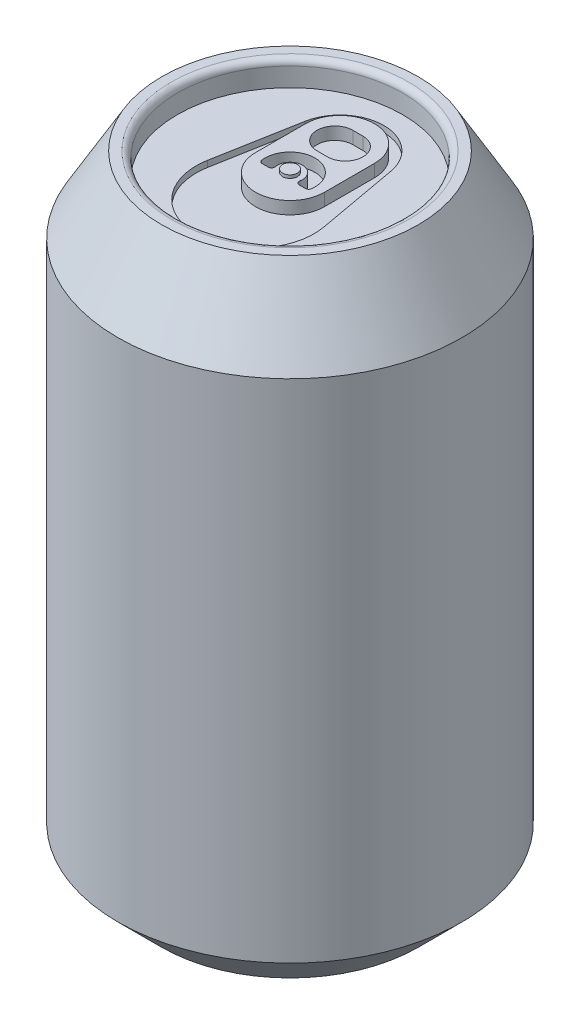
ISO-10303-21;
HEADER;
FILE_DESCRIPTION(('STEP AP214'),'2;1');
FILE_NAME('part.step','',(''),(''),'','','');
FILE_SCHEMA(('AUTOMOTIVE_DESIGN { 1 0 10303 214 1 1 1 1 }'));
ENDSEC;
DATA;
#1=APPLICATION_CONTEXT('core data for automotive mechanical design processes');
#2=APPLICATION_PROTOCOL_DEFINITION('international standard','automotive_design',2000,#1);
#3=PRODUCT_CONTEXT('',#1,'mechanical');
#4=PRODUCT('Part','Part','',(#3));
#5=PRODUCT_RELATED_PRODUCT_CATEGORY('part','',(#4));
#6=PRODUCT_DEFINITION_FORMATION('','',#4);
#7=PRODUCT_DEFINITION_CONTEXT('part definition',#1,'design');
#8=PRODUCT_DEFINITION('design','',#6,#7);
#9=PRODUCT_DEFINITION_SHAPE('','',#8);
#10=(LENGTH_UNIT() NAMED_UNIT(*) SI_UNIT(.MILLI.,.METRE.));
#11=(NAMED_UNIT(*) PLANE_ANGLE_UNIT() SI_UNIT($,.RADIAN.));
#12=(NAMED_UNIT(*) SI_UNIT($,.STERADIAN.) SOLID_ANGLE_UNIT());
#13=UNCERTAINTY_MEASURE_WITH_UNIT(LENGTH_MEASURE(1.E-05),#10,'distance_accuracy_value','');
#14=(GEOMETRIC_REPRESENTATION_CONTEXT(3) GLOBAL_UNCERTAINTY_ASSIGNED_CONTEXT((#13)) GLOBAL_UNIT_ASSIGNED_CONTEXT((#10,
#11,#12)) REPRESENTATION_CONTEXT('',''));
#15=CARTESIAN_POINT('',(0.,0.,0.));
#16=DIRECTION('',(0.,0.,1.));
#17=DIRECTION('',(1.,0.,0.));
#18=AXIS2_PLACEMENT_3D('',#15,#16,#17);
#19=CARTESIAN_POINT('',(0.,100.,0.));
#20=DIRECTION('',(0.,-1.,0.));
#21=DIRECTION('',(0.,0.,-1.));
#22=AXIS2_PLACEMENT_3D('',#19,#20,#21);
#23=CYLINDRICAL_SURFACE('',#22,27.5);
#24=CARTESIAN_POINT('',(0.,7.00000000000001,0.));
#25=DIRECTION('',(0.,1.,0.));
#26=DIRECTION('',(0.,0.,1.));
#27=AXIS2_PLACEMENT_3D('',#24,#25,#26);
#28=CIRCLE('',#27,27.5);
#29=CARTESIAN_POINT('',(0.,7.00000000000001,27.5));
#30=VERTEX_POINT('',#29);
#31=EDGE_CURVE('E303',#30,#30,#28,.T.);
#32=ORIENTED_EDGE('',*,*,#31,.T.);
#33=EDGE_LOOP('',(#32));
#34=FACE_BOUND('',#33,.T.);
#35=CARTESIAN_POINT('',(0.,87.8756443470179,0.));
#36=DIRECTION('',(0.,1.,0.));
#37=DIRECTION('',(0.,0.,1.));
#38=AXIS2_PLACEMENT_3D('',#35,#36,#37);
#39=CIRCLE('',#38,27.5);
#40=CARTESIAN_POINT('',(0.,87.8756443470179,27.5));
#41=VERTEX_POINT('',#40);
#42=EDGE_CURVE('E300',#41,#41,#39,.F.);
#43=ORIENTED_EDGE('',*,*,#42,.T.);
#44=EDGE_LOOP('',(#43));
#45=FACE_BOUND('',#44,.T.);
#46=ADVANCED_FACE('F35',(#34,#45),#23,.T.);
#47=CARTESIAN_POINT('',(0.,100.,0.));
#48=DIRECTION('',(0.,1.,0.));
#49=DIRECTION('',(0.,0.,1.));
#50=AXIS2_PLACEMENT_3D('',#47,#48,#49);
#51=PLANE('',#50);
#52=CARTESIAN_POINT('',(0.,100.,0.));
#53=DIRECTION('',(0.,1.,0.));
#54=DIRECTION('',(0.,0.,1.));
#55=AXIS2_PLACEMENT_3D('',#52,#53,#54);
#56=CIRCLE('',#55,19.);
#57=CARTESIAN_POINT('',(0.,100.,19.));
#58=VERTEX_POINT('',#57);
#59=EDGE_CURVE('E312',#58,#58,#56,.F.);
#60=ORIENTED_EDGE('',*,*,#59,.T.);
#61=EDGE_LOOP('',(#60));
#62=FACE_BOUND('',#61,.T.);
#63=CARTESIAN_POINT('',(0.,100.,0.));
#64=DIRECTION('',(0.,1.,0.));
#65=DIRECTION('',(0.,0.,1.));
#66=AXIS2_PLACEMENT_3D('',#63,#64,#65);
#67=CIRCLE('',#66,20.5);
#68=CARTESIAN_POINT('',(0.,100.,20.5));
#69=VERTEX_POINT('',#68);
#70=EDGE_CURVE('E297',#69,#69,#67,.T.);
#71=ORIENTED_EDGE('',*,*,#70,.T.);
#72=EDGE_LOOP('',(#71));
#73=FACE_BOUND('',#72,.T.);
#74=ADVANCED_FACE('F413',(#62,#73),#51,.T.);
#75=CARTESIAN_POINT('',(0.,0.,0.));
#76=DIRECTION('',(0.,1.,0.));
#77=DIRECTION('',(0.,0.,1.));
#78=AXIS2_PLACEMENT_3D('',#75,#76,#77);
#79=PLANE('',#78);
#80=CARTESIAN_POINT('',(0.,0.,0.));
#81=DIRECTION('',(0.,1.,0.));
#82=DIRECTION('',(0.,0.,1.));
#83=AXIS2_PLACEMENT_3D('',#80,#81,#82);
#84=CIRCLE('',#83,20.5);
#85=CARTESIAN_POINT('',(0.,0.,20.5));
#86=VERTEX_POINT('',#85);
#87=EDGE_CURVE('E306',#86,#86,#84,.F.);
#88=ORIENTED_EDGE('',*,*,#87,.T.);
#89=EDGE_LOOP('',(#88));
#90=FACE_BOUND('',#89,.T.);
#91=ADVANCED_FACE('F419',(#90),#79,.F.);
#92=CARTESIAN_POINT('',(0.,100.,0.));
#93=DIRECTION('',(0.,-1.,0.));
#94=DIRECTION('',(0.,0.,-1.));
#95=AXIS2_PLACEMENT_3D('',#92,#93,#94);
#96=CONICAL_SURFACE('',#95,20.5,0.523598775598302);
#97=ORIENTED_EDGE('',*,*,#42,.F.);
#98=EDGE_LOOP('',(#97));
#99=FACE_BOUND('',#98,.T.);
#100=ORIENTED_EDGE('',*,*,#70,.F.);
#101=EDGE_LOOP('',(#100));
#102=FACE_BOUND('',#101,.T.);
#103=ADVANCED_FACE('F425',(#99,#102),#96,.T.);
#104=CARTESIAN_POINT('',(0.,7.00000000000001,0.));
#105=DIRECTION('',(0.,1.,0.));
#106=DIRECTION('',(0.,0.,1.));
#107=AXIS2_PLACEMENT_3D('',#104,#105,#106);
#108=CONICAL_SURFACE('',#107,27.5,0.785398163397447);
#109=CARTESIAN_POINT('',(0.,0.,20.5));
#110=CARTESIAN_POINT('',(0.,0.0729166666666663,20.5729166666667));
#111=CARTESIAN_POINT('',(0.,0.145833333333333,20.6458333333333));
#112=CARTESIAN_POINT('',(0.,0.291666666666666,20.7916666666667));
#113=CARTESIAN_POINT('',(0.,0.364583333333333,20.8645833333333));
#114=CARTESIAN_POINT('',(0.,0.510416666666666,21.0104166666667));
#115=CARTESIAN_POINT('',(0.,0.583333333333333,21.0833333333333));
#116=CARTESIAN_POINT('',(0.,0.729166666666666,21.2291666666667));
#117=CARTESIAN_POINT('',(0.,0.802083333333333,21.3020833333333));
#118=CARTESIAN_POINT('',(0.,0.947916666666667,21.4479166666667));
#119=CARTESIAN_POINT('',(0.,1.02083333333333,21.5208333333333));
#120=CARTESIAN_POINT('',(0.,1.16666666666667,21.6666666666667));
#121=CARTESIAN_POINT('',(0.,1.23958333333333,21.7395833333333));
#122=CARTESIAN_POINT('',(0.,1.38541666666667,21.8854166666667));
#123=CARTESIAN_POINT('',(0.,1.45833333333333,21.9583333333333));
#124=CARTESIAN_POINT('',(0.,1.60416666666667,22.1041666666667));
#125=CARTESIAN_POINT('',(0.,1.67708333333333,22.1770833333333));
#126=CARTESIAN_POINT('',(0.,1.82291666666667,22.3229166666667));
#127=CARTESIAN_POINT('',(0.,1.89583333333333,22.3958333333333));
#128=CARTESIAN_POINT('',(0.,2.04166666666667,22.5416666666667));
#129=CARTESIAN_POINT('',(0.,2.11458333333333,22.6145833333333));
#130=CARTESIAN_POINT('',(0.,2.26041666666667,22.7604166666667));
#131=CARTESIAN_POINT('',(0.,2.33333333333333,22.8333333333333));
#132=CARTESIAN_POINT('',(0.,2.47916666666667,22.9791666666667));
#133=CARTESIAN_POINT('',(0.,2.55208333333334,23.0520833333333));
#134=CARTESIAN_POINT('',(0.,2.69791666666667,23.1979166666667));
#135=CARTESIAN_POINT('',(0.,2.77083333333334,23.2708333333333));
#136=CARTESIAN_POINT('',(0.,2.91666666666667,23.4166666666667));
#137=CARTESIAN_POINT('',(0.,2.98958333333334,23.4895833333333));
#138=CARTESIAN_POINT('',(0.,3.13541666666667,23.6354166666667));
#139=CARTESIAN_POINT('',(0.,3.20833333333334,23.7083333333333));
#140=CARTESIAN_POINT('',(0.,3.35416666666667,23.8541666666667));
#141=CARTESIAN_POINT('',(0.,3.42708333333334,23.9270833333333));
#142=CARTESIAN_POINT('',(0.,3.57291666666667,24.0729166666667));
#143=CARTESIAN_POINT('',(0.,3.64583333333334,24.1458333333333));
#144=CARTESIAN_POINT('',(0.,3.79166666666667,24.2916666666667));
#145=CARTESIAN_POINT('',(0.,3.86458333333334,24.3645833333333));
#146=CARTESIAN_POINT('',(0.,4.01041666666667,24.5104166666667));
#147=CARTESIAN_POINT('',(0.,4.08333333333334,24.5833333333333));
#148=CARTESIAN_POINT('',(0.,4.22916666666667,24.7291666666667));
#149=CARTESIAN_POINT('',(0.,4.30208333333334,24.8020833333333));
#150=CARTESIAN_POINT('',(0.,4.44791666666667,24.9479166666667));
#151=CARTESIAN_POINT('',(0.,4.52083333333334,25.0208333333333));
#152=CARTESIAN_POINT('',(0.,4.66666666666667,25.1666666666667));
#153=CARTESIAN_POINT('',(0.,4.73958333333334,25.2395833333333));
#154=CARTESIAN_POINT('',(0.,4.88541666666667,25.3854166666667));
#155=CARTESIAN_POINT('',(0.,4.95833333333334,25.4583333333333));
#156=CARTESIAN_POINT('',(0.,5.10416666666667,25.6041666666667));
#157=CARTESIAN_POINT('',(0.,5.17708333333334,25.6770833333333));
#158=CARTESIAN_POINT('',(0.,5.32291666666667,25.8229166666667));
#159=CARTESIAN_POINT('',(0.,5.39583333333334,25.8958333333333));
#160=CARTESIAN_POINT('',(0.,5.54166666666667,26.0416666666667));
#161=CARTESIAN_POINT('',(0.,5.61458333333334,26.1145833333333));
#162=CARTESIAN_POINT('',(0.,5.76041666666667,26.2604166666667));
#163=CARTESIAN_POINT('',(0.,5.83333333333334,26.3333333333333));
#164=CARTESIAN_POINT('',(0.,5.97916666666667,26.4791666666667));
#165=CARTESIAN_POINT('',(0.,6.05208333333334,26.5520833333333));
#166=CARTESIAN_POINT('',(0.,6.19791666666667,26.6979166666667));
#167=CARTESIAN_POINT('',(0.,6.27083333333334,26.7708333333333));
#168=CARTESIAN_POINT('',(0.,6.41666666666667,26.9166666666667));
#169=CARTESIAN_POINT('',(0.,6.48958333333334,26.9895833333333));
#170=CARTESIAN_POINT('',(0.,6.63541666666667,27.1354166666667));
#171=CARTESIAN_POINT('',(0.,6.70833333333334,27.2083333333333));
#172=CARTESIAN_POINT('',(0.,6.85416666666667,27.3541666666667));
#173=CARTESIAN_POINT('',(0.,6.92708333333334,27.4270833333333));
#174=CARTESIAN_POINT('',(0.,7.00000000000001,27.5));
#175=B_SPLINE_CURVE_WITH_KNOTS('',3,(#109,#110,#111,#112,#113,#114,#115,#116,#117,#118,#119,
#120,#121,#122,#123,#124,#125,#126,#127,#128,#129,#130,#131,#132,#133,#134,#135,#136,#137,#138,
#139,#140,#141,#142,#143,#144,#145,#146,#147,#148,#149,#150,#151,#152,#153,#154,#155,#156,#157,
#158,#159,#160,#161,#162,#163,#164,#165,#166,#167,#168,#169,#170,#171,#172,#173,#174),
.UNSPECIFIED.,.F.,.F.,(4,2,2,2,2,2,2,2,2,2,2,2,2,2,2,2,2,2,2,2,2,2,2,2,2,2,2,2,2,2,2,2,4),(0.,
0.309359216769112,0.618718433538227,0.928077650307342,1.23743686707645,1.54679608384557,
1.85615530061468,2.1655145173838,2.47487373415291,2.78423295092203,3.09359216769114,
3.40295138446026,3.71231060122937,4.02166981799849,4.3310290347676,4.64038825153671,
4.94974746830583,5.25910668507494,5.56846590184406,5.87782511861317,6.18718433538229,
6.4965435521514,6.80590276892052,7.11526198568963,7.42462120245875,7.73398041922786,
8.04333963599697,8.35269885276609,8.6620580695352,8.97141728630432,9.28077650307343,
9.59013571984255,9.89949493661166),.UNSPECIFIED.);
#176=EDGE_CURVE('BSEAM428',#86,#30,#175,.T.);
#177=ORIENTED_EDGE('',*,*,#87,.F.);
#178=ORIENTED_EDGE('',*,*,#31,.F.);
#179=ORIENTED_EDGE('',*,*,#176,.T.);
#180=ORIENTED_EDGE('',*,*,#176,.F.);
#181=EDGE_LOOP('',(#177,#179,#178,#180));
#182=FACE_BOUND('',#181,.T.);
#183=ADVANCED_FACE('F428',(#182),#108,.T.);
#184=CARTESIAN_POINT('',(0.,96.,0.));
#185=DIRECTION('',(0.,1.,0.));
#186=DIRECTION('',(0.,0.,1.));
#187=AXIS2_PLACEMENT_3D('',#184,#185,#186);
#188=CYLINDRICAL_SURFACE('',#187,18.);
#189=CARTESIAN_POINT('',(0.,99.,0.));
#190=DIRECTION('',(0.,1.,0.));
#191=DIRECTION('',(0.,0.,1.));
#192=AXIS2_PLACEMENT_3D('',#189,#190,#191);
#193=CIRCLE('',#192,18.);
#194=CARTESIAN_POINT('',(0.,99.,18.));
#195=VERTEX_POINT('',#194);
#196=EDGE_CURVE('E309',#195,#195,#193,.T.);
#197=ORIENTED_EDGE('',*,*,#196,.T.);
#198=EDGE_LOOP('',(#197));
#199=FACE_BOUND('',#198,.T.);
#200=CARTESIAN_POINT('',(0.,96.,0.));
#201=DIRECTION('',(0.,1.,0.));
#202=DIRECTION('',(0.,0.,1.));
#203=AXIS2_PLACEMENT_3D('',#200,#201,#202);
#204=CIRCLE('',#203,18.);
#205=CARTESIAN_POINT('',(0.,96.,18.));
#206=VERTEX_POINT('',#205);
#207=EDGE_CURVE('E288',#206,#206,#204,.T.);
#208=ORIENTED_EDGE('',*,*,#207,.F.);
#209=EDGE_LOOP('',(#208));
#210=FACE_BOUND('',#209,.T.);
#211=ADVANCED_FACE('F432',(#199,#210),#188,.F.);
#212=CARTESIAN_POINT('',(0.,96.,0.));
#213=DIRECTION('',(0.,1.,0.));
#214=DIRECTION('',(0.,0.,1.));
#215=AXIS2_PLACEMENT_3D('',#212,#213,#214);
#216=PLANE('',#215);
#217=DIRECTION('',(-0.178360912210274,0.,-0.983965134034494));
#218=VECTOR('',#217,1.);
#219=CARTESIAN_POINT('',(8.29176328935743,96.,-1.50302730550777));
#220=LINE('',#219,#218);
#221=CARTESIAN_POINT('',(9.27073951579827,96.,3.89769901916369));
#222=VERTEX_POINT('',#221);
#223=CARTESIAN_POINT('',(6.88775593824145,96.,-9.24852638547191));
#224=VERTEX_POINT('',#223);
#225=EDGE_CURVE('E257',#222,#224,#220,.T.);
#226=ORIENTED_EDGE('',*,*,#225,.F.);
#227=CARTESIAN_POINT('',(0.,96.,5.57818291001225));
#228=DIRECTION('',(0.,1.,0.));
#229=DIRECTION('',(0.,0.,1.));
#230=AXIS2_PLACEMENT_3D('',#227,#228,#229);
#231=CIRCLE('',#230,9.42181708998773);
#232=CARTESIAN_POINT('',(-9.27073951579826,96.,3.89769901916369));
#233=VERTEX_POINT('',#232);
#234=EDGE_CURVE('E267',#233,#222,#231,.T.);
#235=ORIENTED_EDGE('',*,*,#234,.F.);
#236=DIRECTION('',(0.178360912210274,0.,-0.983965134034494));
#237=VECTOR('',#236,1.);
#238=CARTESIAN_POINT('',(-8.29176328935743,96.,-1.50302730550776));
#239=LINE('',#238,#237);
#240=CARTESIAN_POINT('',(-6.88775593824145,96.,-9.24852638547191));
#241=VERTEX_POINT('',#240);
#242=EDGE_CURVE('E281',#233,#241,#239,.T.);
#243=ORIENTED_EDGE('',*,*,#242,.T.);
#244=CARTESIAN_POINT('',(0.,96.,-7.99999999999999));
#245=DIRECTION('',(0.,1.,0.));
#246=DIRECTION('',(0.,0.,1.));
#247=AXIS2_PLACEMENT_3D('',#244,#245,#246);
#248=CIRCLE('',#247,7.);
#249=EDGE_CURVE('E278',#224,#241,#248,.T.);
#250=ORIENTED_EDGE('',*,*,#249,.F.);
#251=EDGE_LOOP('',(#226,#235,#243,#250));
#252=FACE_BOUND('',#251,.T.);
#253=ORIENTED_EDGE('',*,*,#207,.T.);
#254=EDGE_LOOP('',(#253));
#255=FACE_BOUND('',#254,.T.);
#256=ADVANCED_FACE('F438',(#252,#255),#216,.T.);
#257=CARTESIAN_POINT('',(0.,99.,0.));
#258=DIRECTION('',(0.,1.,0.));
#259=DIRECTION('',(0.,0.,1.));
#260=AXIS2_PLACEMENT_3D('',#257,#258,#259);
#261=TOROIDAL_SURFACE('',#260,19.,1.);
#262=ORIENTED_EDGE('',*,*,#59,.F.);
#263=EDGE_LOOP('',(#262));
#264=FACE_BOUND('',#263,.T.);
#265=ORIENTED_EDGE('',*,*,#196,.F.);
#266=EDGE_LOOP('',(#265));
#267=FACE_BOUND('',#266,.T.);
#268=ADVANCED_FACE('F434',(#264,#267),#261,.T.);
#269=CARTESIAN_POINT('',(8.29176328935743,95.,-1.50302730550777));
#270=DIRECTION('',(0.983965134034494,0.,-0.178360912210274));
#271=DIRECTION('',(-0.178360912210274,0.,-0.983965134034494));
#272=AXIS2_PLACEMENT_3D('',#269,#270,#271);
#273=PLANE('',#272);
#274=ORIENTED_EDGE('',*,*,#225,.T.);
#275=DIRECTION('',(0.,1.,0.));
#276=VECTOR('',#275,1.);
#277=CARTESIAN_POINT('',(6.88775593824145,95.,-9.24852638547191));
#278=LINE('',#277,#276);
#279=CARTESIAN_POINT('',(6.88775593824145,95.,-9.24852638547191));
#280=VERTEX_POINT('',#279);
#281=EDGE_CURVE('E275',#280,#224,#278,.T.);
#282=ORIENTED_EDGE('',*,*,#281,.F.);
#283=DIRECTION('',(-0.178360912210274,0.,-0.983965134034494));
#284=VECTOR('',#283,1.);
#285=CARTESIAN_POINT('',(8.29176328935743,95.,-1.50302730550777));
#286=LINE('',#285,#284);
#287=CARTESIAN_POINT('',(9.27073951579827,95.,3.89769901916369));
#288=VERTEX_POINT('',#287);
#289=EDGE_CURVE('E263',#288,#280,#286,.T.);
#290=ORIENTED_EDGE('',*,*,#289,.F.);
#291=DIRECTION('',(0.,1.,0.));
#292=VECTOR('',#291,1.);
#293=CARTESIAN_POINT('',(9.27073951579827,95.,3.89769901916369));
#294=LINE('',#293,#292);
#295=EDGE_CURVE('E286',#288,#222,#294,.T.);
#296=ORIENTED_EDGE('',*,*,#295,.T.);
#297=EDGE_LOOP('',(#274,#282,#290,#296));
#298=FACE_BOUND('',#297,.T.);
#299=ADVANCED_FACE('F437',(#298),#273,.F.);
#300=CARTESIAN_POINT('',(0.,95.,5.57818291001225));
#301=DIRECTION('',(0.,1.,0.));
#302=DIRECTION('',(0.,0.,1.));
#303=AXIS2_PLACEMENT_3D('',#300,#301,#302);
#304=CYLINDRICAL_SURFACE('',#303,9.42181708998773);
#305=ORIENTED_EDGE('',*,*,#234,.T.);
#306=ORIENTED_EDGE('',*,*,#295,.F.);
#307=CARTESIAN_POINT('',(0.,95.,5.57818291001225));
#308=DIRECTION('',(0.,1.,0.));
#309=DIRECTION('',(0.,0.,1.));
#310=AXIS2_PLACEMENT_3D('',#307,#308,#309);
#311=CIRCLE('',#310,9.42181708998773);
#312=CARTESIAN_POINT('',(-9.27073951579826,95.,3.89769901916369));
#313=VERTEX_POINT('',#312);
#314=EDGE_CURVE('E272',#313,#288,#311,.T.);
#315=ORIENTED_EDGE('',*,*,#314,.F.);
#316=DIRECTION('',(0.,1.,0.));
#317=VECTOR('',#316,1.);
#318=CARTESIAN_POINT('',(-9.27073951579826,95.,3.89769901916369));
#319=LINE('',#318,#317);
#320=EDGE_CURVE('E289',#313,#233,#319,.T.);
#321=ORIENTED_EDGE('',*,*,#320,.T.);
#322=EDGE_LOOP('',(#305,#306,#315,#321));
#323=FACE_BOUND('',#322,.T.);
#324=ADVANCED_FACE('F615',(#323),#304,.F.);
#325=CARTESIAN_POINT('',(-8.29176328935743,95.,-1.50302730550776));
#326=DIRECTION('',(0.983965134034494,0.,0.178360912210274));
#327=DIRECTION('',(0.178360912210274,0.,-0.983965134034494));
#328=AXIS2_PLACEMENT_3D('',#325,#326,#327);
#329=PLANE('',#328);
#330=ORIENTED_EDGE('',*,*,#242,.F.);
#331=ORIENTED_EDGE('',*,*,#320,.F.);
#332=DIRECTION('',(0.178360912210274,0.,-0.983965134034494));
#333=VECTOR('',#332,1.);
#334=CARTESIAN_POINT('',(-8.29176328935743,95.,-1.50302730550776));
#335=LINE('',#334,#333);
#336=CARTESIAN_POINT('',(-6.88775593824145,95.,-9.24852638547191));
#337=VERTEX_POINT('',#336);
#338=EDGE_CURVE('E270',#313,#337,#335,.T.);
#339=ORIENTED_EDGE('',*,*,#338,.T.);
#340=DIRECTION('',(0.,1.,0.));
#341=VECTOR('',#340,1.);
#342=CARTESIAN_POINT('',(-6.88775593824145,95.,-9.24852638547191));
#343=LINE('',#342,#341);
#344=EDGE_CURVE('E292',#337,#241,#343,.T.);
#345=ORIENTED_EDGE('',*,*,#344,.T.);
#346=EDGE_LOOP('',(#330,#331,#339,#345));
#347=FACE_BOUND('',#346,.T.);
#348=ADVANCED_FACE('F606',(#347),#329,.T.);
#349=CARTESIAN_POINT('',(0.,95.,-7.99999999999999));
#350=DIRECTION('',(0.,1.,0.));
#351=DIRECTION('',(0.,0.,1.));
#352=AXIS2_PLACEMENT_3D('',#349,#350,#351);
#353=CYLINDRICAL_SURFACE('',#352,7.);
#354=ORIENTED_EDGE('',*,*,#249,.T.);
#355=ORIENTED_EDGE('',*,*,#344,.F.);
#356=CARTESIAN_POINT('',(0.,95.,-7.99999999999999));
#357=DIRECTION('',(0.,1.,0.));
#358=DIRECTION('',(0.,0.,1.));
#359=AXIS2_PLACEMENT_3D('',#356,#357,#358);
#360=CIRCLE('',#359,7.);
#361=EDGE_CURVE('E266',#280,#337,#360,.T.);
#362=ORIENTED_EDGE('',*,*,#361,.F.);
#363=ORIENTED_EDGE('',*,*,#281,.T.);
#364=EDGE_LOOP('',(#354,#355,#362,#363));
#365=FACE_BOUND('',#364,.T.);
#366=ADVANCED_FACE('F598',(#365),#353,.F.);
#367=CARTESIAN_POINT('',(0.,95.,0.));
#368=DIRECTION('',(0.,1.,0.));
#369=DIRECTION('',(0.,0.,1.));
#370=AXIS2_PLACEMENT_3D('',#367,#368,#369);
#371=PLANE('',#370);
#372=CARTESIAN_POINT('',(0.,95.,-7.99999999999999));
#373=DIRECTION('',(0.,1.,0.));
#374=DIRECTION('',(0.,0.,1.));
#375=AXIS2_PLACEMENT_3D('',#372,#373,#374);
#376=CIRCLE('',#375,5.5);
#377=CARTESIAN_POINT('',(5.5,95.,-7.99999999999999));
#378=VERTEX_POINT('',#377);
#379=CARTESIAN_POINT('',(-5.5,95.,-7.99999999999999));
#380=VERTEX_POINT('',#379);
#381=EDGE_CURVE('E239',#378,#380,#376,.T.);
#382=ORIENTED_EDGE('',*,*,#381,.F.);
#383=DIRECTION('',(0.,0.,-1.));
#384=VECTOR('',#383,1.);
#385=CARTESIAN_POINT('',(5.5,95.,0.));
#386=LINE('',#385,#384);
#387=CARTESIAN_POINT('',(5.5,95.,0.));
#388=VERTEX_POINT('',#387);
#389=EDGE_CURVE('E236',#388,#378,#386,.T.);
#390=ORIENTED_EDGE('',*,*,#389,.F.);
#391=CARTESIAN_POINT('',(0.,95.,0.));
#392=DIRECTION('',(0.,1.,0.));
#393=DIRECTION('',(0.,0.,1.));
#394=AXIS2_PLACEMENT_3D('',#391,#392,#393);
#395=CIRCLE('',#394,5.5);
#396=CARTESIAN_POINT('',(-5.5,95.,0.));
#397=VERTEX_POINT('',#396);
#398=EDGE_CURVE('E245',#397,#388,#395,.T.);
#399=ORIENTED_EDGE('',*,*,#398,.F.);
#400=DIRECTION('',(0.,0.,-1.));
#401=VECTOR('',#400,1.);
#402=CARTESIAN_POINT('',(-5.5,95.,0.));
#403=LINE('',#402,#401);
#404=EDGE_CURVE('E242',#397,#380,#403,.T.);
#405=ORIENTED_EDGE('',*,*,#404,.T.);
#406=EDGE_LOOP('',(#382,#390,#399,#405));
#407=FACE_BOUND('',#406,.T.);
#408=ORIENTED_EDGE('',*,*,#289,.T.);
#409=ORIENTED_EDGE('',*,*,#361,.T.);
#410=ORIENTED_EDGE('',*,*,#338,.F.);
#411=ORIENTED_EDGE('',*,*,#314,.T.);
#412=EDGE_LOOP('',(#408,#409,#410,#411));
#413=FACE_BOUND('',#412,.T.);
#414=ADVANCED_FACE('F409',(#407,#413),#371,.T.);
#415=CARTESIAN_POINT('',(5.5,97.,0.));
#416=DIRECTION('',(-1.,0.,0.));
#417=DIRECTION('',(0.,0.,1.));
#418=AXIS2_PLACEMENT_3D('',#415,#416,#417);
#419=PLANE('',#418);
#420=ORIENTED_EDGE('',*,*,#389,.T.);
#421=DIRECTION('',(0.,-1.,0.));
#422=VECTOR('',#421,1.);
#423=CARTESIAN_POINT('',(5.5,97.,-7.99999999999999));
#424=LINE('',#423,#422);
#425=CARTESIAN_POINT('',(5.5,97.,-7.99999999999999));
#426=VERTEX_POINT('',#425);
#427=EDGE_CURVE('E255',#426,#378,#424,.T.);
#428=ORIENTED_EDGE('',*,*,#427,.F.);
#429=DIRECTION('',(0.,0.,-1.));
#430=VECTOR('',#429,1.);
#431=CARTESIAN_POINT('',(5.5,97.,0.));
#432=LINE('',#431,#430);
#433=CARTESIAN_POINT('',(5.5,97.,0.));
#434=VERTEX_POINT('',#433);
#435=EDGE_CURVE('E204',#434,#426,#432,.T.);
#436=ORIENTED_EDGE('',*,*,#435,.F.);
#437=DIRECTION('',(0.,-1.,0.));
#438=VECTOR('',#437,1.);
#439=CARTESIAN_POINT('',(5.5,97.,0.));
#440=LINE('',#439,#438);
#441=EDGE_CURVE('E182',#434,#388,#440,.T.);
#442=ORIENTED_EDGE('',*,*,#441,.T.);
#443=EDGE_LOOP('',(#420,#428,#436,#442));
#444=FACE_BOUND('',#443,.T.);
#445=ADVANCED_FACE('F571',(#444),#419,.F.);
#446=CARTESIAN_POINT('',(0.,97.,-7.99999999999999));
#447=DIRECTION('',(0.,-1.,0.));
#448=DIRECTION('',(0.,0.,-1.));
#449=AXIS2_PLACEMENT_3D('',#446,#447,#448);
#450=CYLINDRICAL_SURFACE('',#449,5.5);
#451=ORIENTED_EDGE('',*,*,#381,.T.);
#452=DIRECTION('',(0.,-1.,0.));
#453=VECTOR('',#452,1.);
#454=CARTESIAN_POINT('',(-5.5,97.,-7.99999999999999));
#455=LINE('',#454,#453);
#456=CARTESIAN_POINT('',(-5.5,97.,-7.99999999999999));
#457=VERTEX_POINT('',#456);
#458=EDGE_CURVE('E253',#457,#380,#455,.T.);
#459=ORIENTED_EDGE('',*,*,#458,.F.);
#460=CARTESIAN_POINT('',(0.,97.,-7.99999999999999));
#461=DIRECTION('',(0.,1.,0.));
#462=DIRECTION('',(0.,0.,1.));
#463=AXIS2_PLACEMENT_3D('',#460,#461,#462);
#464=CIRCLE('',#463,5.5);
#465=EDGE_CURVE('E207',#426,#457,#464,.T.);
#466=ORIENTED_EDGE('',*,*,#465,.F.);
#467=ORIENTED_EDGE('',*,*,#427,.T.);
#468=EDGE_LOOP('',(#451,#459,#466,#467));
#469=FACE_BOUND('',#468,.T.);
#470=ADVANCED_FACE('F562',(#469),#450,.T.);
#471=CARTESIAN_POINT('',(-5.5,97.,0.));
#472=DIRECTION('',(-1.,0.,0.));
#473=DIRECTION('',(0.,0.,1.));
#474=AXIS2_PLACEMENT_3D('',#471,#472,#473);
#475=PLANE('',#474);
#476=ORIENTED_EDGE('',*,*,#404,.F.);
#477=DIRECTION('',(0.,-1.,0.));
#478=VECTOR('',#477,1.);
#479=CARTESIAN_POINT('',(-5.5,97.,0.));
#480=LINE('',#479,#478);
#481=CARTESIAN_POINT('',(-5.5,97.,0.));
#482=VERTEX_POINT('',#481);
#483=EDGE_CURVE('E250',#482,#397,#480,.T.);
#484=ORIENTED_EDGE('',*,*,#483,.F.);
#485=DIRECTION('',(0.,0.,-1.));
#486=VECTOR('',#485,1.);
#487=CARTESIAN_POINT('',(-5.5,97.,0.));
#488=LINE('',#487,#486);
#489=EDGE_CURVE('E209',#482,#457,#488,.T.);
#490=ORIENTED_EDGE('',*,*,#489,.T.);
#491=ORIENTED_EDGE('',*,*,#458,.T.);
#492=EDGE_LOOP('',(#476,#484,#490,#491));
#493=FACE_BOUND('',#492,.T.);
#494=ADVANCED_FACE('F554',(#493),#475,.T.);
#495=CARTESIAN_POINT('',(0.824231798432009,97.,-7.99999999999999));
#496=DIRECTION('',(0.,-1.,0.));
#497=DIRECTION('',(0.,0.,-1.));
#498=AXIS2_PLACEMENT_3D('',#495,#496,#497);
#499=CYLINDRICAL_SURFACE('',#498,2.8533822879084);
#500=CARTESIAN_POINT('',(0.824231798432009,95.,-7.99999999999999));
#501=DIRECTION('',(0.,1.,0.));
#502=DIRECTION('',(0.,0.,1.));
#503=AXIS2_PLACEMENT_3D('',#500,#501,#502);
#504=CIRCLE('',#503,2.8533822879084);
#505=CARTESIAN_POINT('',(0.824231798432008,95.,-5.14661771209159));
#506=VERTEX_POINT('',#505);
#507=CARTESIAN_POINT('',(0.824231798432009,95.,-10.8533822879084));
#508=VERTEX_POINT('',#507);
#509=EDGE_CURVE('E177',#506,#508,#504,.T.);
#510=ORIENTED_EDGE('',*,*,#509,.F.);
#511=DIRECTION('',(0.,-1.,0.));
#512=VECTOR('',#511,1.);
#513=CARTESIAN_POINT('',(0.824231798432008,97.,-5.14661771209159));
#514=LINE('',#513,#512);
#515=CARTESIAN_POINT('',(0.824231798432008,97.,-5.14661771209159));
#516=VERTEX_POINT('',#515);
#517=EDGE_CURVE('E172',#516,#506,#514,.T.);
#518=ORIENTED_EDGE('',*,*,#517,.F.);
#519=CARTESIAN_POINT('',(0.824231798432009,97.,-7.99999999999999));
#520=DIRECTION('',(0.,1.,0.));
#521=DIRECTION('',(0.,0.,1.));
#522=AXIS2_PLACEMENT_3D('',#519,#520,#521);
#523=CIRCLE('',#522,2.8533822879084);
#524=CARTESIAN_POINT('',(0.824231798432009,97.,-10.8533822879084));
#525=VERTEX_POINT('',#524);
#526=EDGE_CURVE('E175',#516,#525,#523,.T.);
#527=ORIENTED_EDGE('',*,*,#526,.T.);
#528=DIRECTION('',(0.,-1.,0.));
#529=VECTOR('',#528,1.);
#530=CARTESIAN_POINT('',(0.824231798432009,97.,-10.8533822879084));
#531=LINE('',#530,#529);
#532=EDGE_CURVE('E214',#525,#508,#531,.T.);
#533=ORIENTED_EDGE('',*,*,#532,.T.);
#534=EDGE_LOOP('',(#510,#518,#527,#533));
#535=FACE_BOUND('',#534,.T.);
#536=ADVANCED_FACE('F174',(#535),#499,.F.);
#537=CARTESIAN_POINT('',(0.,97.,-5.14661771209159));
#538=DIRECTION('',(0.,0.,-1.));
#539=DIRECTION('',(-1.,0.,0.));
#540=AXIS2_PLACEMENT_3D('',#537,#538,#539);
#541=PLANE('',#540);
#542=DIRECTION('',(1.,0.,0.));
#543=VECTOR('',#542,1.);
#544=CARTESIAN_POINT('',(0.,95.,-5.14661771209159));
#545=LINE('',#544,#543);
#546=CARTESIAN_POINT('',(-0.824231798432009,95.,-5.14661771209159));
#547=VERTEX_POINT('',#546);
#548=EDGE_CURVE('E228',#547,#506,#545,.T.);
#549=ORIENTED_EDGE('',*,*,#548,.F.);
#550=DIRECTION('',(0.,-1.,0.));
#551=VECTOR('',#550,1.);
#552=CARTESIAN_POINT('',(-0.824231798432009,97.,-5.14661771209159));
#553=LINE('',#552,#551);
#554=CARTESIAN_POINT('',(-0.824231798432009,97.,-5.14661771209159));
#555=VERTEX_POINT('',#554);
#556=EDGE_CURVE('E183',#555,#547,#553,.T.);
#557=ORIENTED_EDGE('',*,*,#556,.F.);
#558=DIRECTION('',(1.,0.,0.));
#559=VECTOR('',#558,1.);
#560=CARTESIAN_POINT('',(0.,97.,-5.14661771209159));
#561=LINE('',#560,#559);
#562=EDGE_CURVE('E190',#555,#516,#561,.T.);
#563=ORIENTED_EDGE('',*,*,#562,.T.);
#564=ORIENTED_EDGE('',*,*,#517,.T.);
#565=EDGE_LOOP('',(#549,#557,#563,#564));
#566=FACE_BOUND('',#565,.T.);
#567=ADVANCED_FACE('F197',(#566),#541,.T.);
#568=CARTESIAN_POINT('',(-0.824231798432009,97.,-7.99999999999999));
#569=DIRECTION('',(0.,-1.,0.));
#570=DIRECTION('',(0.,0.,-1.));
#571=AXIS2_PLACEMENT_3D('',#568,#569,#570);
#572=CYLINDRICAL_SURFACE('',#571,2.8533822879084);
#573=CARTESIAN_POINT('',(-0.824231798432009,95.,-7.99999999999999));
#574=DIRECTION('',(0.,1.,0.));
#575=DIRECTION('',(0.,0.,1.));
#576=AXIS2_PLACEMENT_3D('',#573,#574,#575);
#577=CIRCLE('',#576,2.8533822879084);
#578=CARTESIAN_POINT('',(-0.824231798432008,95.,-10.8533822879084));
#579=VERTEX_POINT('',#578);
#580=EDGE_CURVE('E230',#579,#547,#577,.T.);
#581=ORIENTED_EDGE('',*,*,#580,.F.);
#582=DIRECTION('',(0.,-1.,0.));
#583=VECTOR('',#582,1.);
#584=CARTESIAN_POINT('',(-0.824231798432008,97.,-10.8533822879084));
#585=LINE('',#584,#583);
#586=CARTESIAN_POINT('',(-0.824231798432008,97.,-10.8533822879084));
#587=VERTEX_POINT('',#586);
#588=EDGE_CURVE('E259',#587,#579,#585,.T.);
#589=ORIENTED_EDGE('',*,*,#588,.F.);
#590=CARTESIAN_POINT('',(-0.824231798432009,97.,-7.99999999999999));
#591=DIRECTION('',(0.,1.,0.));
#592=DIRECTION('',(0.,0.,1.));
#593=AXIS2_PLACEMENT_3D('',#590,#591,#592);
#594=CIRCLE('',#593,2.8533822879084);
#595=EDGE_CURVE('E198',#587,#555,#594,.T.);
#596=ORIENTED_EDGE('',*,*,#595,.T.);
#597=ORIENTED_EDGE('',*,*,#556,.T.);
#598=EDGE_LOOP('',(#581,#589,#596,#597));
#599=FACE_BOUND('',#598,.T.);
#600=ADVANCED_FACE('F532',(#599),#572,.F.);
#601=CARTESIAN_POINT('',(0.,97.,0.));
#602=DIRECTION('',(0.,-1.,0.));
#603=DIRECTION('',(0.,0.,-1.));
#604=AXIS2_PLACEMENT_3D('',#601,#602,#603);
#605=CYLINDRICAL_SURFACE('',#604,4.);
#606=CARTESIAN_POINT('',(0.,95.,0.));
#607=DIRECTION('',(0.,1.,0.));
#608=DIRECTION('',(0.,0.,1.));
#609=AXIS2_PLACEMENT_3D('',#606,#607,#608);
#610=CIRCLE('',#609,4.);
#611=CARTESIAN_POINT('',(3.95897327444314,95.,0.571428571428573));
#612=VERTEX_POINT('',#611);
#613=CARTESIAN_POINT('',(-3.95897327444314,95.,0.571428571428573));
#614=VERTEX_POINT('',#613);
#615=EDGE_CURVE('E215',#612,#614,#610,.T.);
#616=ORIENTED_EDGE('',*,*,#615,.F.);
#617=DIRECTION('',(0.,-1.,0.));
#618=VECTOR('',#617,1.);
#619=CARTESIAN_POINT('',(3.95897327444315,97.,0.571428571428573));
#620=LINE('',#619,#618);
#621=CARTESIAN_POINT('',(3.95897327444314,97.,0.571428571428573));
#622=VERTEX_POINT('',#621);
#623=EDGE_CURVE('E331',#612,#622,#620,.F.);
#624=ORIENTED_EDGE('',*,*,#623,.T.);
#625=CARTESIAN_POINT('',(0.,97.,0.));
#626=DIRECTION('',(0.,1.,0.));
#627=DIRECTION('',(0.,0.,1.));
#628=AXIS2_PLACEMENT_3D('',#625,#626,#627);
#629=CIRCLE('',#628,4.);
#630=CARTESIAN_POINT('',(-3.95897327444314,97.,0.571428571428573));
#631=VERTEX_POINT('',#630);
#632=EDGE_CURVE('E247',#622,#631,#629,.T.);
#633=ORIENTED_EDGE('',*,*,#632,.T.);
#634=DIRECTION('',(0.,-1.,0.));
#635=VECTOR('',#634,1.);
#636=CARTESIAN_POINT('',(-3.95897327444315,97.,0.571428571428573));
#637=LINE('',#636,#635);
#638=EDGE_CURVE('E328',#631,#614,#637,.T.);
#639=ORIENTED_EDGE('',*,*,#638,.T.);
#640=EDGE_LOOP('',(#616,#624,#633,#639));
#641=FACE_BOUND('',#640,.T.);
#642=ADVANCED_FACE('F356',(#641),#605,.F.);
#643=CARTESIAN_POINT('',(0.,97.,1.));
#644=DIRECTION('',(0.,0.,-1.));
#645=DIRECTION('',(-1.,0.,0.));
#646=AXIS2_PLACEMENT_3D('',#643,#644,#645);
#647=PLANE('',#646);
#648=DIRECTION('',(1.,0.,0.));
#649=VECTOR('',#648,1.);
#650=CARTESIAN_POINT('',(0.,97.,1.));
#651=LINE('',#650,#649);
#652=CARTESIAN_POINT('',(2.44948974278318,97.,1.));
#653=VERTEX_POINT('',#652);
#654=CARTESIAN_POINT('',(3.46410161513775,97.,1.));
#655=VERTEX_POINT('',#654);
#656=EDGE_CURVE('E358',#653,#655,#651,.T.);
#657=ORIENTED_EDGE('',*,*,#656,.T.);
#658=DIRECTION('',(0.,1.,0.));
#659=VECTOR('',#658,1.);
#660=CARTESIAN_POINT('',(3.46410161513775,95.,1.));
#661=LINE('',#660,#659);
#662=CARTESIAN_POINT('',(3.46410161513775,95.,1.));
#663=VERTEX_POINT('',#662);
#664=EDGE_CURVE('E317',#655,#663,#661,.F.);
#665=ORIENTED_EDGE('',*,*,#664,.T.);
#666=DIRECTION('',(1.,0.,0.));
#667=VECTOR('',#666,1.);
#668=CARTESIAN_POINT('',(0.,95.,1.));
#669=LINE('',#668,#667);
#670=CARTESIAN_POINT('',(2.44948974278318,95.,1.));
#671=VERTEX_POINT('',#670);
#672=EDGE_CURVE('E218',#671,#663,#669,.T.);
#673=ORIENTED_EDGE('',*,*,#672,.F.);
#674=DIRECTION('',(0.,-1.,0.));
#675=VECTOR('',#674,1.);
#676=CARTESIAN_POINT('',(2.44948974278318,97.,1.));
#677=LINE('',#676,#675);
#678=EDGE_CURVE('E315',#671,#653,#677,.F.);
#679=ORIENTED_EDGE('',*,*,#678,.T.);
#680=EDGE_LOOP('',(#657,#665,#673,#679));
#681=FACE_BOUND('',#680,.T.);
#682=ADVANCED_FACE('F379',(#681),#647,.T.);
#683=CARTESIAN_POINT('',(0.,97.,0.));
#684=DIRECTION('',(0.,-1.,0.));
#685=DIRECTION('',(0.,0.,-1.));
#686=AXIS2_PLACEMENT_3D('',#683,#684,#685);
#687=CYLINDRICAL_SURFACE('',#686,2.);
#688=CARTESIAN_POINT('',(0.,97.,0.));
#689=DIRECTION('',(0.,1.,0.));
#690=DIRECTION('',(0.,0.,1.));
#691=AXIS2_PLACEMENT_3D('',#688,#689,#690);
#692=CIRCLE('',#691,2.);
#693=CARTESIAN_POINT('',(1.95959179422654,97.,0.400000000000001));
#694=VERTEX_POINT('',#693);
#695=CARTESIAN_POINT('',(-1.95959179422654,97.,0.400000000000001));
#696=VERTEX_POINT('',#695);
#697=EDGE_CURVE('E372',#694,#696,#692,.T.);
#698=ORIENTED_EDGE('',*,*,#697,.F.);
#699=DIRECTION('',(0.,-1.,0.));
#700=VECTOR('',#699,1.);
#701=CARTESIAN_POINT('',(1.95959179422654,97.,0.400000000000001));
#702=LINE('',#701,#700);
#703=CARTESIAN_POINT('',(1.95959179422654,95.,0.400000000000001));
#704=VERTEX_POINT('',#703);
#705=EDGE_CURVE('E339',#694,#704,#702,.T.);
#706=ORIENTED_EDGE('',*,*,#705,.T.);
#707=CARTESIAN_POINT('',(0.,95.,0.));
#708=DIRECTION('',(0.,1.,0.));
#709=DIRECTION('',(0.,0.,1.));
#710=AXIS2_PLACEMENT_3D('',#707,#708,#709);
#711=CIRCLE('',#710,2.);
#712=CARTESIAN_POINT('',(-1.95959179422654,95.,0.400000000000001));
#713=VERTEX_POINT('',#712);
#714=EDGE_CURVE('E222',#704,#713,#711,.T.);
#715=ORIENTED_EDGE('',*,*,#714,.T.);
#716=DIRECTION('',(0.,-1.,0.));
#717=VECTOR('',#716,1.);
#718=CARTESIAN_POINT('',(-1.95959179422654,97.,0.400000000000001));
#719=LINE('',#718,#717);
#720=EDGE_CURVE('E50',#713,#696,#719,.F.);
#721=ORIENTED_EDGE('',*,*,#720,.T.);
#722=EDGE_LOOP('',(#698,#706,#715,#721));
#723=FACE_BOUND('',#722,.T.);
#724=ADVANCED_FACE('F370',(#723),#687,.T.);
#725=CARTESIAN_POINT('',(0.,97.,-10.8533822879084));
#726=DIRECTION('',(0.,0.,-1.));
#727=DIRECTION('',(-1.,0.,0.));
#728=AXIS2_PLACEMENT_3D('',#725,#726,#727);
#729=PLANE('',#728);
#730=DIRECTION('',(1.,0.,0.));
#731=VECTOR('',#730,1.);
#732=CARTESIAN_POINT('',(0.,95.,-10.8533822879084));
#733=LINE('',#732,#731);
#734=EDGE_CURVE('E233',#579,#508,#733,.T.);
#735=ORIENTED_EDGE('',*,*,#734,.T.);
#736=ORIENTED_EDGE('',*,*,#532,.F.);
#737=DIRECTION('',(1.,0.,0.));
#738=VECTOR('',#737,1.);
#739=CARTESIAN_POINT('',(0.,97.,-10.8533822879084));
#740=LINE('',#739,#738);
#741=EDGE_CURVE('E193',#587,#525,#740,.T.);
#742=ORIENTED_EDGE('',*,*,#741,.F.);
#743=ORIENTED_EDGE('',*,*,#588,.T.);
#744=EDGE_LOOP('',(#735,#736,#742,#743));
#745=FACE_BOUND('',#744,.T.);
#746=ADVANCED_FACE('F502',(#745),#729,.F.);
#747=CARTESIAN_POINT('',(0.,97.,1.));
#748=DIRECTION('',(0.,0.,1.));
#749=DIRECTION('',(1.,0.,0.));
#750=AXIS2_PLACEMENT_3D('',#747,#748,#749);
#751=PLANE('',#750);
#752=DIRECTION('',(-1.,0.,0.));
#753=VECTOR('',#752,1.);
#754=CARTESIAN_POINT('',(0.,95.,1.));
#755=LINE('',#754,#753);
#756=CARTESIAN_POINT('',(-2.44948974278318,95.,1.));
#757=VERTEX_POINT('',#756);
#758=CARTESIAN_POINT('',(-3.46410161513775,95.,1.));
#759=VERTEX_POINT('',#758);
#760=EDGE_CURVE('E224',#757,#759,#755,.T.);
#761=ORIENTED_EDGE('',*,*,#760,.T.);
#762=DIRECTION('',(0.,-1.,0.));
#763=VECTOR('',#762,1.);
#764=CARTESIAN_POINT('',(-3.46410161513775,97.,1.));
#765=LINE('',#764,#763);
#766=CARTESIAN_POINT('',(-3.46410161513775,97.,1.));
#767=VERTEX_POINT('',#766);
#768=EDGE_CURVE('E336',#759,#767,#765,.F.);
#769=ORIENTED_EDGE('',*,*,#768,.T.);
#770=DIRECTION('',(-1.,0.,0.));
#771=VECTOR('',#770,1.);
#772=CARTESIAN_POINT('',(0.,97.,1.));
#773=LINE('',#772,#771);
#774=CARTESIAN_POINT('',(-2.44948974278318,97.,1.));
#775=VERTEX_POINT('',#774);
#776=EDGE_CURVE('E195',#775,#767,#773,.T.);
#777=ORIENTED_EDGE('',*,*,#776,.F.);
#778=DIRECTION('',(0.,1.,0.));
#779=VECTOR('',#778,1.);
#780=CARTESIAN_POINT('',(-2.44948974278318,95.,1.));
#781=LINE('',#780,#779);
#782=EDGE_CURVE('E333',#775,#757,#781,.F.);
#783=ORIENTED_EDGE('',*,*,#782,.T.);
#784=EDGE_LOOP('',(#761,#769,#777,#783));
#785=FACE_BOUND('',#784,.T.);
#786=ADVANCED_FACE('F365',(#785),#751,.F.);
#787=CARTESIAN_POINT('',(0.,97.,0.));
#788=DIRECTION('',(0.,-1.,0.));
#789=DIRECTION('',(0.,0.,-1.));
#790=AXIS2_PLACEMENT_3D('',#787,#788,#789);
#791=CYLINDRICAL_SURFACE('',#790,5.5);
#792=ORIENTED_EDGE('',*,*,#398,.T.);
#793=ORIENTED_EDGE('',*,*,#441,.F.);
#794=CARTESIAN_POINT('',(0.,97.,0.));
#795=DIRECTION('',(0.,1.,0.));
#796=DIRECTION('',(0.,0.,1.));
#797=AXIS2_PLACEMENT_3D('',#794,#795,#796);
#798=CIRCLE('',#797,5.5);
#799=EDGE_CURVE('E212',#482,#434,#798,.T.);
#800=ORIENTED_EDGE('',*,*,#799,.F.);
#801=ORIENTED_EDGE('',*,*,#483,.T.);
#802=EDGE_LOOP('',(#792,#793,#800,#801));
#803=FACE_BOUND('',#802,.T.);
#804=ADVANCED_FACE('F401',(#803),#791,.T.);
#805=CARTESIAN_POINT('',(0.,97.,0.));
#806=DIRECTION('',(0.,1.,0.));
#807=DIRECTION('',(0.,0.,1.));
#808=AXIS2_PLACEMENT_3D('',#805,#806,#807);
#809=PLANE('',#808);
#810=CARTESIAN_POINT('',(0.,97.,0.));
#811=DIRECTION('',(0.,1.,0.));
#812=DIRECTION('',(0.,0.,1.));
#813=AXIS2_PLACEMENT_3D('',#810,#811,#812);
#814=CIRCLE('',#813,1.18534953307403);
#815=CARTESIAN_POINT('',(0.,97.,1.18534953307403));
#816=VERTEX_POINT('',#815);
#817=EDGE_CURVE('E386',#816,#816,#814,.T.);
#818=ORIENTED_EDGE('',*,*,#817,.F.);
#819=EDGE_LOOP('',(#818));
#820=FACE_BOUND('',#819,.T.);
#821=ORIENTED_EDGE('',*,*,#632,.F.);
#822=CARTESIAN_POINT('',(3.46410161513775,97.,0.500000000000001));
#823=DIRECTION('',(0.,1.,0.));
#824=DIRECTION('',(0.,0.,1.));
#825=AXIS2_PLACEMENT_3D('',#822,#823,#824);
#826=CIRCLE('',#825,0.5);
#827=EDGE_CURVE('E342',#622,#655,#826,.F.);
#828=ORIENTED_EDGE('',*,*,#827,.T.);
#829=ORIENTED_EDGE('',*,*,#656,.F.);
#830=CARTESIAN_POINT('',(2.44948974278318,97.,0.500000000000001));
#831=DIRECTION('',(0.,1.,0.));
#832=DIRECTION('',(0.,0.,1.));
#833=AXIS2_PLACEMENT_3D('',#830,#831,#832);
#834=CIRCLE('',#833,0.5);
#835=EDGE_CURVE('E43',#653,#694,#834,.F.);
#836=ORIENTED_EDGE('',*,*,#835,.T.);
#837=ORIENTED_EDGE('',*,*,#697,.T.);
#838=CARTESIAN_POINT('',(-2.44948974278318,97.,0.500000000000001));
#839=DIRECTION('',(0.,1.,0.));
#840=DIRECTION('',(0.,0.,1.));
#841=AXIS2_PLACEMENT_3D('',#838,#839,#840);
#842=CIRCLE('',#841,0.5);
#843=EDGE_CURVE('E11',#696,#775,#842,.F.);
#844=ORIENTED_EDGE('',*,*,#843,.T.);
#845=ORIENTED_EDGE('',*,*,#776,.T.);
#846=CARTESIAN_POINT('',(-3.46410161513775,97.,0.500000000000001));
#847=DIRECTION('',(0.,1.,0.));
#848=DIRECTION('',(0.,0.,1.));
#849=AXIS2_PLACEMENT_3D('',#846,#847,#848);
#850=CIRCLE('',#849,0.5);
#851=EDGE_CURVE('E344',#767,#631,#850,.F.);
#852=ORIENTED_EDGE('',*,*,#851,.T.);
#853=EDGE_LOOP('',(#821,#828,#829,#836,#837,#844,#845,#852));
#854=FACE_BOUND('',#853,.T.);
#855=ORIENTED_EDGE('',*,*,#526,.F.);
#856=ORIENTED_EDGE('',*,*,#562,.F.);
#857=ORIENTED_EDGE('',*,*,#595,.F.);
#858=ORIENTED_EDGE('',*,*,#741,.T.);
#859=EDGE_LOOP('',(#855,#856,#857,#858));
#860=FACE_BOUND('',#859,.T.);
#861=ORIENTED_EDGE('',*,*,#435,.T.);
#862=ORIENTED_EDGE('',*,*,#465,.T.);
#863=ORIENTED_EDGE('',*,*,#489,.F.);
#864=ORIENTED_EDGE('',*,*,#799,.T.);
#865=EDGE_LOOP('',(#861,#862,#863,#864));
#866=FACE_BOUND('',#865,.T.);
#867=ADVANCED_FACE('F187',(#820,#854,#860,#866),#809,.T.);
#868=ORIENTED_EDGE('',*,*,#672,.T.);
#869=CARTESIAN_POINT('',(3.46410161513775,95.,0.500000000000001));
#870=DIRECTION('',(0.,1.,0.));
#871=DIRECTION('',(0.,0.,1.));
#872=AXIS2_PLACEMENT_3D('',#869,#870,#871);
#873=CIRCLE('',#872,0.5);
#874=EDGE_CURVE('E326',#663,#612,#873,.T.);
#875=ORIENTED_EDGE('',*,*,#874,.T.);
#876=ORIENTED_EDGE('',*,*,#615,.T.);
#877=CARTESIAN_POINT('',(-3.46410161513775,95.,0.500000000000001));
#878=DIRECTION('',(0.,1.,0.));
#879=DIRECTION('',(0.,0.,1.));
#880=AXIS2_PLACEMENT_3D('',#877,#878,#879);
#881=CIRCLE('',#880,0.5);
#882=EDGE_CURVE('E324',#614,#759,#881,.T.);
#883=ORIENTED_EDGE('',*,*,#882,.T.);
#884=ORIENTED_EDGE('',*,*,#760,.F.);
#885=CARTESIAN_POINT('',(-2.44948974278318,95.,0.500000000000001));
#886=DIRECTION('',(0.,1.,0.));
#887=DIRECTION('',(0.,0.,1.));
#888=AXIS2_PLACEMENT_3D('',#885,#886,#887);
#889=CIRCLE('',#888,0.5);
#890=EDGE_CURVE('E320',#757,#713,#889,.T.);
#891=ORIENTED_EDGE('',*,*,#890,.T.);
#892=ORIENTED_EDGE('',*,*,#714,.F.);
#893=CARTESIAN_POINT('',(2.44948974278318,95.,0.500000000000001));
#894=DIRECTION('',(0.,1.,0.));
#895=DIRECTION('',(0.,0.,1.));
#896=AXIS2_PLACEMENT_3D('',#893,#894,#895);
#897=CIRCLE('',#896,0.5);
#898=EDGE_CURVE('E322',#704,#671,#897,.T.);
#899=ORIENTED_EDGE('',*,*,#898,.T.);
#900=EDGE_LOOP('',(#868,#875,#876,#883,#884,#891,#892,#899));
#901=FACE_BOUND('',#900,.T.);
#902=ADVANCED_FACE('F363',(#901),#371,.T.);
#903=ORIENTED_EDGE('',*,*,#509,.T.);
#904=ORIENTED_EDGE('',*,*,#734,.F.);
#905=ORIENTED_EDGE('',*,*,#580,.T.);
#906=ORIENTED_EDGE('',*,*,#548,.T.);
#907=EDGE_LOOP('',(#903,#904,#905,#906));
#908=FACE_BOUND('',#907,.T.);
#909=ADVANCED_FACE('F407',(#908),#371,.T.);
#910=CARTESIAN_POINT('',(3.46410161513775,97.,0.500000000000001));
#911=DIRECTION('',(0.,-1.,0.));
#912=DIRECTION('',(0.,0.,-1.));
#913=AXIS2_PLACEMENT_3D('',#910,#911,#912);
#914=CYLINDRICAL_SURFACE('',#913,0.5);
#915=ORIENTED_EDGE('',*,*,#827,.F.);
#916=ORIENTED_EDGE('',*,*,#623,.F.);
#917=ORIENTED_EDGE('',*,*,#874,.F.);
#918=ORIENTED_EDGE('',*,*,#664,.F.);
#919=EDGE_LOOP('',(#915,#916,#917,#918));
#920=FACE_BOUND('',#919,.T.);
#921=ADVANCED_FACE('F382',(#920),#914,.F.);
#922=CARTESIAN_POINT('',(-3.46410161513775,97.,0.500000000000001));
#923=DIRECTION('',(0.,-1.,0.));
#924=DIRECTION('',(0.,0.,-1.));
#925=AXIS2_PLACEMENT_3D('',#922,#923,#924);
#926=CYLINDRICAL_SURFACE('',#925,0.5);
#927=ORIENTED_EDGE('',*,*,#851,.F.);
#928=ORIENTED_EDGE('',*,*,#768,.F.);
#929=ORIENTED_EDGE('',*,*,#882,.F.);
#930=ORIENTED_EDGE('',*,*,#638,.F.);
#931=EDGE_LOOP('',(#927,#928,#929,#930));
#932=FACE_BOUND('',#931,.T.);
#933=ADVANCED_FACE('F360',(#932),#926,.F.);
#934=CARTESIAN_POINT('',(2.44948974278318,97.,0.500000000000001));
#935=DIRECTION('',(0.,-1.,0.));
#936=DIRECTION('',(0.,0.,-1.));
#937=AXIS2_PLACEMENT_3D('',#934,#935,#936);
#938=CYLINDRICAL_SURFACE('',#937,0.5);
#939=ORIENTED_EDGE('',*,*,#835,.F.);
#940=ORIENTED_EDGE('',*,*,#678,.F.);
#941=ORIENTED_EDGE('',*,*,#898,.F.);
#942=ORIENTED_EDGE('',*,*,#705,.F.);
#943=EDGE_LOOP('',(#939,#940,#941,#942));
#944=FACE_BOUND('',#943,.T.);
#945=ADVANCED_FACE('F374',(#944),#938,.F.);
#946=CARTESIAN_POINT('',(-2.44948974278318,97.,0.500000000000001));
#947=DIRECTION('',(0.,-1.,0.));
#948=DIRECTION('',(0.,0.,-1.));
#949=AXIS2_PLACEMENT_3D('',#946,#947,#948);
#950=CYLINDRICAL_SURFACE('',#949,0.5);
#951=ORIENTED_EDGE('',*,*,#843,.F.);
#952=ORIENTED_EDGE('',*,*,#720,.F.);
#953=ORIENTED_EDGE('',*,*,#890,.F.);
#954=ORIENTED_EDGE('',*,*,#782,.F.);
#955=EDGE_LOOP('',(#951,#952,#953,#954));
#956=FACE_BOUND('',#955,.T.);
#957=ADVANCED_FACE('F37',(#956),#950,.F.);
#958=CARTESIAN_POINT('',(0.,97.5,0.));
#959=DIRECTION('',(0.,-1.,0.));
#960=DIRECTION('',(0.,0.,-1.));
#961=AXIS2_PLACEMENT_3D('',#958,#959,#960);
#962=CYLINDRICAL_SURFACE('',#961,1.18534953307403);
#963=CARTESIAN_POINT('',(0.,97.5,0.));
#964=DIRECTION('',(0.,1.,0.));
#965=DIRECTION('',(0.,0.,1.));
#966=AXIS2_PLACEMENT_3D('',#963,#964,#965);
#967=CIRCLE('',#966,1.18534953307403);
#968=CARTESIAN_POINT('',(0.,97.5,1.18534953307403));
#969=VERTEX_POINT('',#968);
#970=EDGE_CURVE('E219',#969,#969,#967,.T.);
#971=ORIENTED_EDGE('',*,*,#970,.F.);
#972=EDGE_LOOP('',(#971));
#973=FACE_BOUND('',#972,.T.);
#974=ORIENTED_EDGE('',*,*,#817,.T.);
#975=EDGE_LOOP('',(#974));
#976=FACE_BOUND('',#975,.T.);
#977=ADVANCED_FACE('F394',(#973,#976),#962,.T.);
#978=CARTESIAN_POINT('',(0.,97.5,0.));
#979=DIRECTION('',(0.,1.,0.));
#980=DIRECTION('',(0.,0.,1.));
#981=AXIS2_PLACEMENT_3D('',#978,#979,#980);
#982=PLANE('',#981);
#983=ORIENTED_EDGE('',*,*,#970,.T.);
#984=EDGE_LOOP('',(#983));
#985=FACE_BOUND('',#984,.T.);
#986=ADVANCED_FACE('F392',(#985),#982,.T.);
#987=CLOSED_SHELL('',(#46,#74,#91,#103,#183,#211,#256,#268,#299,#324,#348,#366,#414,#445,#470,
#494,#536,#567,#600,#642,#682,#724,#746,#786,#804,#867,#902,#909,#921,#933,#945,#957,#977,#986));
#988=MANIFOLD_SOLID_BREP('B2',#987);
#989=ADVANCED_BREP_SHAPE_REPRESENTATION('',(#18,#988),#14);
#990=SHAPE_DEFINITION_REPRESENTATION(#9,#989);
ENDSEC;
END-ISO-10303-21;
